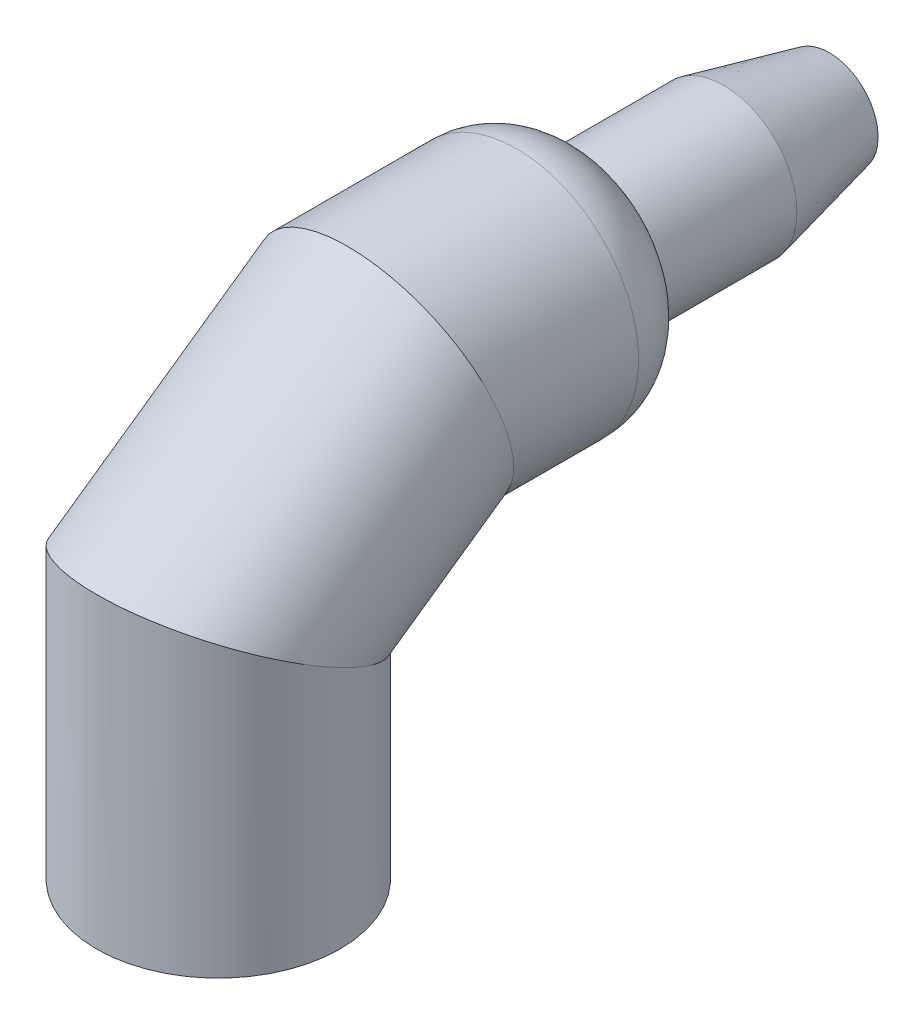
ISO-10303-21;
HEADER;
FILE_DESCRIPTION(('STEP AP214'),'2;1');
FILE_NAME('part.step','',(''),(''),'','','');
FILE_SCHEMA(('AUTOMOTIVE_DESIGN { 1 0 10303 214 1 1 1 1 }'));
ENDSEC;
DATA;
#1=APPLICATION_CONTEXT('core data for automotive mechanical design processes');
#2=APPLICATION_PROTOCOL_DEFINITION('international standard','automotive_design',2000,#1);
#3=PRODUCT_CONTEXT('',#1,'mechanical');
#4=PRODUCT('Part','Part','',(#3));
#5=PRODUCT_RELATED_PRODUCT_CATEGORY('part','',(#4));
#6=PRODUCT_DEFINITION_FORMATION('','',#4);
#7=PRODUCT_DEFINITION_CONTEXT('part definition',#1,'design');
#8=PRODUCT_DEFINITION('design','',#6,#7);
#9=PRODUCT_DEFINITION_SHAPE('','',#8);
#10=(LENGTH_UNIT() NAMED_UNIT(*) SI_UNIT(.MILLI.,.METRE.));
#11=(NAMED_UNIT(*) PLANE_ANGLE_UNIT() SI_UNIT($,.RADIAN.));
#12=(NAMED_UNIT(*) SI_UNIT($,.STERADIAN.) SOLID_ANGLE_UNIT());
#13=UNCERTAINTY_MEASURE_WITH_UNIT(LENGTH_MEASURE(1.E-05),#10,'distance_accuracy_value','');
#14=(GEOMETRIC_REPRESENTATION_CONTEXT(3) GLOBAL_UNCERTAINTY_ASSIGNED_CONTEXT((#13)) GLOBAL_UNIT_ASSIGNED_CONTEXT((#10,
#11,#12)) REPRESENTATION_CONTEXT('',''));
#15=CARTESIAN_POINT('',(0.,0.,0.));
#16=DIRECTION('',(0.,0.,1.));
#17=DIRECTION('',(1.,0.,0.));
#18=AXIS2_PLACEMENT_3D('',#15,#16,#17);
#19=CARTESIAN_POINT('',(0.,7.4099556112507,3.49237003628969));
#20=DIRECTION('',(0.,0.,-1.));
#21=DIRECTION('',(-1.,0.,0.));
#22=AXIS2_PLACEMENT_3D('',#19,#20,#21);
#23=CYLINDRICAL_SURFACE('',#22,2.5);
#24=CARTESIAN_POINT('',(0.,7.4099556112507,-1.02393748817261));
#25=DIRECTION('',(0.,0.,-1.));
#26=DIRECTION('',(-1.,0.,0.));
#27=AXIS2_PLACEMENT_3D('',#24,#25,#26);
#28=CIRCLE('',#27,2.5);
#29=CARTESIAN_POINT('',(-2.5,7.4099556112507,-1.02393748817261));
#30=VERTEX_POINT('',#29);
#31=EDGE_CURVE('E70',#30,#30,#28,.F.);
#32=ORIENTED_EDGE('',*,*,#31,.T.);
#33=EDGE_LOOP('',(#32));
#34=FACE_BOUND('',#33,.T.);
#35=CARTESIAN_POINT('',(0.,7.4099556112507,1.6582266974553));
#36=DIRECTION('',(0.,0.300705799504271,-0.953716950748228));
#37=DIRECTION('',(0.,0.953716950748228,0.300705799504271));
#38=AXIS2_PLACEMENT_3D('',#35,#36,#37);
#39=ELLIPSE('',#38,2.62132281285202,2.5);
#40=CARTESIAN_POINT('',(0.,9.9099556112507,2.44647366965275));
#41=VERTEX_POINT('',#40);
#42=EDGE_CURVE('E84',#41,#41,#39,.T.);
#43=ORIENTED_EDGE('',*,*,#42,.T.);
#44=EDGE_LOOP('',(#43));
#45=FACE_BOUND('',#44,.T.);
#46=ADVANCED_FACE('F62',(#34,#45),#23,.T.);
#47=CARTESIAN_POINT('',(0.,7.4099556112507,3.49237003628969));
#48=DIRECTION('',(0.,0.,-1.));
#49=DIRECTION('',(-1.,0.,0.));
#50=AXIS2_PLACEMENT_3D('',#47,#48,#49);
#51=CYLINDRICAL_SURFACE('',#50,1.5);
#52=CARTESIAN_POINT('',(0.,7.4099556112507,1.6582266974553));
#53=DIRECTION('',(0.,0.300705799504271,-0.953716950748228));
#54=DIRECTION('',(0.,-0.953716950748228,-0.300705799504271));
#55=AXIS2_PLACEMENT_3D('',#52,#53,#54);
#56=ELLIPSE('',#55,1.57279368771121,1.5);
#57=CARTESIAN_POINT('',(1.5,7.4099556112507,1.6582266974553));
#58=VERTEX_POINT('',#57);
#59=EDGE_CURVE('E79',#58,#58,#56,.T.);
#60=ORIENTED_EDGE('',*,*,#59,.F.);
#61=EDGE_LOOP('',(#60));
#62=FACE_BOUND('',#61,.T.);
#63=CARTESIAN_POINT('',(0.,7.4099556112507,-0.938151050545701));
#64=DIRECTION('',(0.,0.,-1.));
#65=DIRECTION('',(-1.,0.,0.));
#66=AXIS2_PLACEMENT_3D('',#63,#64,#65);
#67=CIRCLE('',#66,1.5);
#68=CARTESIAN_POINT('',(-1.5,7.4099556112507,-0.938151050545701));
#69=VERTEX_POINT('',#68);
#70=EDGE_CURVE('E82',#69,#69,#67,.T.);
#71=ORIENTED_EDGE('',*,*,#70,.T.);
#72=EDGE_LOOP('',(#71));
#73=FACE_BOUND('',#72,.T.);
#74=ADVANCED_FACE('F148',(#62,#73),#51,.F.);
#75=CARTESIAN_POINT('',(0.,3.30042489081005,7.52724480449817));
#76=DIRECTION('',(0.,0.573576436351042,-0.819152044288995));
#77=DIRECTION('',(0.,0.819152044288995,0.573576436351042));
#78=AXIS2_PLACEMENT_3D('',#75,#76,#77);
#79=CYLINDRICAL_SURFACE('',#78,2.5);
#80=CARTESIAN_POINT('',(0.,5.,5.1));
#81=DIRECTION('',(0.,0.88701083317822,-0.461748613235036));
#82=DIRECTION('',(0.,0.461748613235036,0.88701083317822));
#83=AXIS2_PLACEMENT_3D('',#80,#81,#82);
#84=ELLIPSE('',#83,2.81845486716586,2.5);
#85=CARTESIAN_POINT('',(0.,6.30141762637937,7.6));
#86=VERTEX_POINT('',#85);
#87=EDGE_CURVE('E96',#86,#86,#84,.T.);
#88=ORIENTED_EDGE('',*,*,#87,.T.);
#89=EDGE_LOOP('',(#88));
#90=FACE_BOUND('',#89,.T.);
#91=ORIENTED_EDGE('',*,*,#42,.F.);
#92=EDGE_LOOP('',(#91));
#93=FACE_BOUND('',#92,.T.);
#94=ADVANCED_FACE('F151',(#90,#93),#79,.T.);
#95=CARTESIAN_POINT('',(0.,0.,5.1));
#96=DIRECTION('',(0.,1.,0.));
#97=DIRECTION('',(0.,0.,1.));
#98=AXIS2_PLACEMENT_3D('',#95,#96,#97);
#99=CYLINDRICAL_SURFACE('',#98,2.5);
#100=CARTESIAN_POINT('',(0.,0.,5.1));
#101=DIRECTION('',(0.,-1.,0.));
#102=DIRECTION('',(1.,0.,0.));
#103=AXIS2_PLACEMENT_3D('',#100,#101,#102);
#104=CIRCLE('',#103,2.5);
#105=CARTESIAN_POINT('',(2.5,0.,5.1));
#106=VERTEX_POINT('',#105);
#107=EDGE_CURVE('E93',#106,#106,#104,.T.);
#108=ORIENTED_EDGE('',*,*,#107,.F.);
#109=EDGE_LOOP('',(#108));
#110=FACE_BOUND('',#109,.T.);
#111=ORIENTED_EDGE('',*,*,#87,.F.);
#112=EDGE_LOOP('',(#111));
#113=FACE_BOUND('',#112,.T.);
#114=ADVANCED_FACE('F152',(#110,#113),#99,.T.);
#115=CARTESIAN_POINT('',(0.,3.30042489081005,7.52724480449817));
#116=DIRECTION('',(0.,0.573576436351042,-0.819152044288995));
#117=DIRECTION('',(0.,0.819152044288995,0.573576436351042));
#118=AXIS2_PLACEMENT_3D('',#115,#116,#117);
#119=CYLINDRICAL_SURFACE('',#118,1.5);
#120=CARTESIAN_POINT('',(0.,5.,5.1));
#121=DIRECTION('',(0.,0.887010833178221,-0.461748613235036));
#122=DIRECTION('',(0.,-0.461748613235036,-0.887010833178221));
#123=AXIS2_PLACEMENT_3D('',#120,#121,#122);
#124=ELLIPSE('',#123,1.69107292029952,1.5);
#125=CARTESIAN_POINT('',(1.5,5.,5.1));
#126=VERTEX_POINT('',#125);
#127=EDGE_CURVE('E75',#126,#126,#124,.T.);
#128=ORIENTED_EDGE('',*,*,#127,.F.);
#129=EDGE_LOOP('',(#128));
#130=FACE_BOUND('',#129,.T.);
#131=ORIENTED_EDGE('',*,*,#59,.T.);
#132=EDGE_LOOP('',(#131));
#133=FACE_BOUND('',#132,.T.);
#134=ADVANCED_FACE('F80',(#130,#133),#119,.F.);
#135=CARTESIAN_POINT('',(0.,0.,5.1));
#136=DIRECTION('',(0.,1.,0.));
#137=DIRECTION('',(0.,0.,1.));
#138=AXIS2_PLACEMENT_3D('',#135,#136,#137);
#139=CYLINDRICAL_SURFACE('',#138,1.5);
#140=CARTESIAN_POINT('',(0.,2.,5.1));
#141=DIRECTION('',(0.,-1.,0.));
#142=DIRECTION('',(0.,0.,-1.));
#143=AXIS2_PLACEMENT_3D('',#140,#141,#142);
#144=CIRCLE('',#143,1.5);
#145=CARTESIAN_POINT('',(0.,2.,3.6));
#146=VERTEX_POINT('',#145);
#147=EDGE_CURVE('E12',#146,#146,#144,.T.);
#148=ORIENTED_EDGE('',*,*,#147,.T.);
#149=EDGE_LOOP('',(#148));
#150=FACE_BOUND('',#149,.T.);
#151=ORIENTED_EDGE('',*,*,#127,.T.);
#152=EDGE_LOOP('',(#151));
#153=FACE_BOUND('',#152,.T.);
#154=ADVANCED_FACE('F155',(#150,#153),#139,.F.);
#155=CARTESIAN_POINT('',(0.,7.4099556112507,-2.4381510505457));
#156=DIRECTION('',(0.,0.,-1.));
#157=DIRECTION('',(-1.,0.,0.));
#158=AXIS2_PLACEMENT_3D('',#155,#156,#157);
#159=CYLINDRICAL_SURFACE('',#158,1.5);
#160=CARTESIAN_POINT('',(0.,7.4099556112507,-5.27148438387904));
#161=DIRECTION('',(0.,0.,1.));
#162=DIRECTION('',(1.,0.,0.));
#163=AXIS2_PLACEMENT_3D('',#160,#161,#162);
#164=CIRCLE('',#163,1.5);
#165=CARTESIAN_POINT('',(1.5,7.4099556112507,-5.27148438387904));
#166=VERTEX_POINT('',#165);
#167=EDGE_CURVE('E116',#166,#166,#164,.F.);
#168=ORIENTED_EDGE('',*,*,#167,.F.);
#169=EDGE_LOOP('',(#168));
#170=FACE_BOUND('',#169,.T.);
#171=CARTESIAN_POINT('',(0.,7.4099556112507,-2.4381510505457));
#172=DIRECTION('',(0.,0.,-1.));
#173=DIRECTION('',(-1.,0.,0.));
#174=AXIS2_PLACEMENT_3D('',#171,#172,#173);
#175=CIRCLE('',#174,1.5);
#176=CARTESIAN_POINT('',(-1.5,7.4099556112507,-2.4381510505457));
#177=VERTEX_POINT('',#176);
#178=EDGE_CURVE('E114',#177,#177,#175,.T.);
#179=ORIENTED_EDGE('',*,*,#178,.T.);
#180=EDGE_LOOP('',(#179));
#181=FACE_BOUND('',#180,.T.);
#182=ADVANCED_FACE('F157',(#170,#181),#159,.T.);
#183=CARTESIAN_POINT('',(0.,7.4099556112507,-7.4381510505457));
#184=DIRECTION('',(0.,0.,-1.));
#185=DIRECTION('',(-1.,0.,0.));
#186=AXIS2_PLACEMENT_3D('',#183,#184,#185);
#187=PLANE('',#186);
#188=CARTESIAN_POINT('',(0.,7.4099556112507,-7.4381510505457));
#189=DIRECTION('',(0.,0.,-1.));
#190=DIRECTION('',(-1.,0.,0.));
#191=AXIS2_PLACEMENT_3D('',#188,#189,#190);
#192=CIRCLE('',#191,0.5);
#193=CARTESIAN_POINT('',(-0.5,7.4099556112507,-7.4381510505457));
#194=VERTEX_POINT('',#193);
#195=EDGE_CURVE('E117',#194,#194,#192,.T.);
#196=ORIENTED_EDGE('',*,*,#195,.F.);
#197=EDGE_LOOP('',(#196));
#198=FACE_BOUND('',#197,.T.);
#199=CARTESIAN_POINT('',(0.,7.4099556112507,-7.4381510505457));
#200=DIRECTION('',(0.,0.,-1.));
#201=DIRECTION('',(-1.,0.,0.));
#202=AXIS2_PLACEMENT_3D('',#199,#200,#201);
#203=CIRCLE('',#202,1.);
#204=CARTESIAN_POINT('',(-1.,7.4099556112507,-7.4381510505457));
#205=VERTEX_POINT('',#204);
#206=EDGE_CURVE('E87',#205,#205,#203,.T.);
#207=ORIENTED_EDGE('',*,*,#206,.T.);
#208=EDGE_LOOP('',(#207));
#209=FACE_BOUND('',#208,.T.);
#210=ADVANCED_FACE('F144',(#198,#209),#187,.T.);
#211=CARTESIAN_POINT('',(0.,7.4099556112507,-7.4381510505457));
#212=DIRECTION('',(0.,0.,1.));
#213=DIRECTION('',(1.,0.,0.));
#214=AXIS2_PLACEMENT_3D('',#211,#212,#213);
#215=CONICAL_SURFACE('',#214,1.,0.226798848053886);
#216=ORIENTED_EDGE('',*,*,#167,.T.);
#217=EDGE_LOOP('',(#216));
#218=FACE_BOUND('',#217,.T.);
#219=ORIENTED_EDGE('',*,*,#206,.F.);
#220=EDGE_LOOP('',(#219));
#221=FACE_BOUND('',#220,.T.);
#222=ADVANCED_FACE('F133',(#218,#221),#215,.T.);
#223=CARTESIAN_POINT('',(-0.5,7.4099556112507,-7.4381510505457));
#224=CARTESIAN_POINT('',(-0.971768159245619,7.64589340957132,-0.938151050545701));
#225=CARTESIAN_POINT('',(-0.5,6.4099556112507,-7.4381510505457));
#226=CARTESIAN_POINT('',(-1.44364375588686,5.70235709108008,-0.938151050545701));
#227=CARTESIAN_POINT('',(0.5,6.4099556112507,-7.4381510505457));
#228=CARTESIAN_POINT('',(0.499892562604379,5.23048149443885,-0.938151050545701));
#229=CARTESIAN_POINT('',(0.5,7.4099556112507,-7.4381510505457));
#230=CARTESIAN_POINT('',(0.971768159245619,7.17401781293008,-0.938151050545701));
#231=CARTESIAN_POINT('',(0.5,8.4099556112507,-7.4381510505457));
#232=CARTESIAN_POINT('',(1.44364375588686,9.11755413142132,-0.938151050545701));
#233=CARTESIAN_POINT('',(-0.5,8.4099556112507,-7.4381510505457));
#234=CARTESIAN_POINT('',(-0.499892562604379,9.58942972806256,-0.938151050545701));
#235=CARTESIAN_POINT('',(-0.5,7.4099556112507,-7.4381510505457));
#236=CARTESIAN_POINT('',(-0.971768159245619,7.64589340957132,-0.938151050545701));
#237=(BOUNDED_SURFACE() B_SPLINE_SURFACE(3,1,((#223,#224),(#225,#226),(#227,#228),(#229,#230),
(#231,#232),(#233,#234),(#235,#236)),.UNSPECIFIED.,.T.,.F.,.F.) B_SPLINE_SURFACE_WITH_KNOTS((4,
3,4),(2,2),(0.,0.5,1.),(0.,1.),
.UNSPECIFIED.) GEOMETRIC_REPRESENTATION_ITEM() RATIONAL_B_SPLINE_SURFACE(((1.,1.),
(0.333333333333333,0.333333333333334),(0.333333333333333,0.333333333333334),(1.,1.),
(0.333333333333333,0.333333333333333),(0.333333333333333,0.333333333333333),(1.,1.))) REPRESENTATION_ITEM('') SURFACE());
#238=CARTESIAN_POINT('',(0.,7.4099556112507,-2.01244519570353));
#239=DIRECTION('',(0.,0.,1.));
#240=DIRECTION('',(1.,0.,0.));
#241=AXIS2_PLACEMENT_3D('',#238,#239,#240);
#242=CIRCLE('',#241,0.91523666764072);
#243=CARTESIAN_POINT('',(-0.893796194422626,7.60689854874713,-2.01244519570353));
#244=VERTEX_POINT('',#243);
#245=EDGE_CURVE('E99',#244,#244,#242,.T.);
#246=CARTESIAN_POINT('',(-0.893796194422626,7.60689854874713,-2.01244519570353));
#247=CARTESIAN_POINT('',(-0.889694150730724,7.60484705981487,-2.0689629650248));
#248=CARTESIAN_POINT('',(-0.885592107038821,7.60279557088262,-2.12548073434607));
#249=CARTESIAN_POINT('',(-0.877388019655017,7.59869259301811,-2.23851627298862));
#250=CARTESIAN_POINT('',(-0.873285975963114,7.59664110408585,-2.29503404230989));
#251=CARTESIAN_POINT('',(-0.86508188857931,7.59253812622134,-2.40806958095244));
#252=CARTESIAN_POINT('',(-0.860979844887407,7.59048663728909,-2.46458735027371));
#253=CARTESIAN_POINT('',(-0.852775757503603,7.58638365942458,-2.57762288891626));
#254=CARTESIAN_POINT('',(-0.8486737138117,7.58433217049233,-2.63414065823753));
#255=CARTESIAN_POINT('',(-0.840469626427895,7.58022919262782,-2.74717619688007));
#256=CARTESIAN_POINT('',(-0.836367582735993,7.57817770369556,-2.80369396620135));
#257=CARTESIAN_POINT('',(-0.828163495352188,7.57407472583106,-2.91672950484389));
#258=CARTESIAN_POINT('',(-0.824061451660286,7.5720232368988,-2.97324727416516));
#259=CARTESIAN_POINT('',(-0.815857364276481,7.56792025903429,-3.08628281280771));
#260=CARTESIAN_POINT('',(-0.811755320584579,7.56586877010204,-3.14280058212898));
#261=CARTESIAN_POINT('',(-0.803551233200774,7.56176579223753,-3.25583612077153));
#262=CARTESIAN_POINT('',(-0.799449189508872,7.55971430330527,-3.3123538900928));
#263=CARTESIAN_POINT('',(-0.791245102125067,7.55561132544076,-3.42538942873535));
#264=CARTESIAN_POINT('',(-0.787143058433165,7.55355983650851,-3.48190719805662));
#265=CARTESIAN_POINT('',(-0.77893897104936,7.549456858644,-3.59494273669916));
#266=CARTESIAN_POINT('',(-0.774836927357458,7.54740536971175,-3.65146050602044));
#267=CARTESIAN_POINT('',(-0.766632839973653,7.54330239184724,-3.76449604466298));
#268=CARTESIAN_POINT('',(-0.762530796281751,7.54125090291498,-3.82101381398425));
#269=CARTESIAN_POINT('',(-0.754326708897946,7.53714792505048,-3.9340493526268));
#270=CARTESIAN_POINT('',(-0.750224665206044,7.53509643611822,-3.99056712194807));
#271=CARTESIAN_POINT('',(-0.742020577822239,7.53099345825371,-4.10360266059062));
#272=CARTESIAN_POINT('',(-0.737918534130337,7.52894196932146,-4.16012042991189));
#273=CARTESIAN_POINT('',(-0.729714446746532,7.52483899145695,-4.27315596855443));
#274=CARTESIAN_POINT('',(-0.72561240305463,7.52278750252469,-4.32967373787571));
#275=CARTESIAN_POINT('',(-0.717408315670825,7.51868452466018,-4.44270927651825));
#276=CARTESIAN_POINT('',(-0.713306271978923,7.51663303572793,-4.49922704583952));
#277=CARTESIAN_POINT('',(-0.705102184595118,7.51253005786342,-4.61226258448207));
#278=CARTESIAN_POINT('',(-0.701000140903215,7.51047856893117,-4.66878035380334));
#279=CARTESIAN_POINT('',(-0.692796053519411,7.50637559106666,-4.78181589244589));
#280=CARTESIAN_POINT('',(-0.688694009827508,7.5043241021344,-4.83833366176716));
#281=CARTESIAN_POINT('',(-0.680489922443704,7.5002211242699,-4.95136920040971));
#282=CARTESIAN_POINT('',(-0.676387878751801,7.49816963533764,-5.00788696973098));
#283=CARTESIAN_POINT('',(-0.668183791367997,7.49406665747313,-5.12092250837352));
#284=CARTESIAN_POINT('',(-0.664081747676094,7.49201516854088,-5.1774402776948));
#285=CARTESIAN_POINT('',(-0.65587766029229,7.48791219067637,-5.29047581633734));
#286=CARTESIAN_POINT('',(-0.651775616600387,7.48586070174411,-5.34699358565861));
#287=CARTESIAN_POINT('',(-0.643571529216582,7.48175772387961,-5.46002912430116));
#288=CARTESIAN_POINT('',(-0.63946948552468,7.47970623494735,-5.51654689362243));
#289=CARTESIAN_POINT('',(-0.631265398140875,7.47560325708284,-5.62958243226498));
#290=CARTESIAN_POINT('',(-0.627163354448973,7.47355176815059,-5.68610020158625));
#291=CARTESIAN_POINT('',(-0.618959267065168,7.46944879028608,-5.79913574022879));
#292=CARTESIAN_POINT('',(-0.614857223373266,7.46739730135382,-5.85565350955007));
#293=CARTESIAN_POINT('',(-0.606653135989461,7.46329432348931,-5.96868904819261));
#294=CARTESIAN_POINT('',(-0.602551092297559,7.46124283455706,-6.02520681751389));
#295=CARTESIAN_POINT('',(-0.594347004913754,7.45713985669255,-6.13824235615643));
#296=CARTESIAN_POINT('',(-0.590244961221852,7.4550883677603,-6.1947601254777));
#297=CARTESIAN_POINT('',(-0.582040873838047,7.45098538989579,-6.30779566412025));
#298=CARTESIAN_POINT('',(-0.577938830146145,7.44893390096353,-6.36431343344152));
#299=CARTESIAN_POINT('',(-0.56973474276234,7.44483092309903,-6.47734897208407));
#300=CARTESIAN_POINT('',(-0.565632699070438,7.44277943416677,-6.53386674140534));
#301=CARTESIAN_POINT('',(-0.557428611686633,7.43867645630226,-6.64690228004788));
#302=CARTESIAN_POINT('',(-0.553326567994731,7.43662496737001,-6.70342004936916));
#303=CARTESIAN_POINT('',(-0.545122480610926,7.4325219895055,-6.8164555880117));
#304=CARTESIAN_POINT('',(-0.541020436919024,7.43047050057324,-6.87297335733297));
#305=CARTESIAN_POINT('',(-0.532816349535219,7.42636752270874,-6.98600889597552));
#306=CARTESIAN_POINT('',(-0.528714305843317,7.42431603377648,-7.04252666529679));
#307=CARTESIAN_POINT('',(-0.520510218459512,7.42021305591197,-7.15556220393934));
#308=CARTESIAN_POINT('',(-0.516408174767609,7.41816156697972,-7.21207997326061));
#309=CARTESIAN_POINT('',(-0.508204087383805,7.41405858911521,-7.32511551190316));
#310=CARTESIAN_POINT('',(-0.504102043691902,7.41200710018295,-7.38163328122443));
#311=CARTESIAN_POINT('',(-0.5,7.4099556112507,-7.4381510505457));
#312=B_SPLINE_CURVE_WITH_KNOTS('',3,(#246,#247,#248,#249,#250,#251,#252,#253,#254,#255,#256,
#257,#258,#259,#260,#261,#262,#263,#264,#265,#266,#267,#268,#269,#270,#271,#272,#273,#274,#275,
#276,#277,#278,#279,#280,#281,#282,#283,#284,#285,#286,#287,#288,#289,#290,#291,#292,#293,#294,
#295,#296,#297,#298,#299,#300,#301,#302,#303,#304,#305,#306,#307,#308,#309,#310,#311),
.UNSPECIFIED.,.F.,.F.,(4,2,2,2,2,2,2,2,2,2,2,2,2,2,2,2,2,2,2,2,2,2,2,2,2,2,2,2,2,2,2,2,4),(0.,
0.170110677398799,0.340221354797598,0.510332032196397,0.680442709595195,0.850553386993994,
1.02066406439279,1.19077474179159,1.36088541919039,1.53099609658919,1.70110677398799,
1.87121745138679,2.04132812878558,2.21143880618438,2.38154948358318,2.55166016098198,
2.72177083838078,2.89188151577958,3.06199219317838,3.23210287057718,3.40221354797597,
3.57232422537477,3.74243490277357,3.91254558017237,4.08265625757117,4.25276693496997,
4.42287761236877,4.59298828976757,4.76309896716637,4.93320964456516,5.10332032196396,
5.27343099936276,5.44354167676156),.UNSPECIFIED.);
#313=EDGE_CURVE('BSEAM143',#244,#194,#312,.T.);
#314=ORIENTED_EDGE('',*,*,#245,.T.);
#315=ORIENTED_EDGE('',*,*,#195,.T.);
#316=ORIENTED_EDGE('',*,*,#313,.T.);
#317=ORIENTED_EDGE('',*,*,#313,.F.);
#318=EDGE_LOOP('',(#314,#316,#315,#317));
#319=FACE_BOUND('',#318,.T.);
#320=ADVANCED_FACE('F143',(#319),#237,.F.);
#321=CARTESIAN_POINT('',(0.,7.4099556112507,-2.13011670111725));
#322=DIRECTION('',(0.,0.,1.));
#323=DIRECTION('',(1.,0.,0.));
#324=AXIS2_PLACEMENT_3D('',#321,#322,#323);
#325=TOROIDAL_SURFACE('',#324,2.41061401694546,1.5);
#326=ORIENTED_EDGE('',*,*,#70,.F.);
#327=EDGE_LOOP('',(#326));
#328=FACE_BOUND('',#327,.T.);
#329=ORIENTED_EDGE('',*,*,#245,.F.);
#330=EDGE_LOOP('',(#329));
#331=FACE_BOUND('',#330,.T.);
#332=ADVANCED_FACE('F111',(#328,#331),#325,.T.);
#333=CARTESIAN_POINT('',(0.,7.4099556112507,-1.02393748817261));
#334=DIRECTION('',(0.,0.,-1.));
#335=DIRECTION('',(-1.,0.,0.));
#336=AXIS2_PLACEMENT_3D('',#333,#334,#335);
#337=DEGENERATE_TOROIDAL_SURFACE('',#336,1.,1.5,.T.);
#338=ORIENTED_EDGE('',*,*,#31,.F.);
#339=EDGE_LOOP('',(#338));
#340=FACE_BOUND('',#339,.T.);
#341=ORIENTED_EDGE('',*,*,#178,.F.);
#342=EDGE_LOOP('',(#341));
#343=FACE_BOUND('',#342,.T.);
#344=ADVANCED_FACE('F108',(#340,#343),#337,.T.);
#345=CARTESIAN_POINT('',(0.,2.,5.1));
#346=DIRECTION('',(0.,-1.,0.));
#347=DIRECTION('',(0.,0.,-1.));
#348=AXIS2_PLACEMENT_3D('',#345,#346,#347);
#349=TOROIDAL_SURFACE('',#348,4.,2.5);
#350=ORIENTED_EDGE('',*,*,#107,.T.);
#351=EDGE_LOOP('',(#350));
#352=FACE_BOUND('',#351,.T.);
#353=ORIENTED_EDGE('',*,*,#147,.F.);
#354=EDGE_LOOP('',(#353));
#355=FACE_BOUND('',#354,.T.);
#356=ADVANCED_FACE('F64',(#352,#355),#349,.T.);
#357=CLOSED_SHELL('',(#46,#74,#94,#114,#134,#154,#182,#210,#222,#320,#332,#344,#356));
#358=MANIFOLD_SOLID_BREP('B2',#357);
#359=ADVANCED_BREP_SHAPE_REPRESENTATION('',(#18,#358),#14);
#360=SHAPE_DEFINITION_REPRESENTATION(#9,#359);
ENDSEC;
END-ISO-10303-21;
